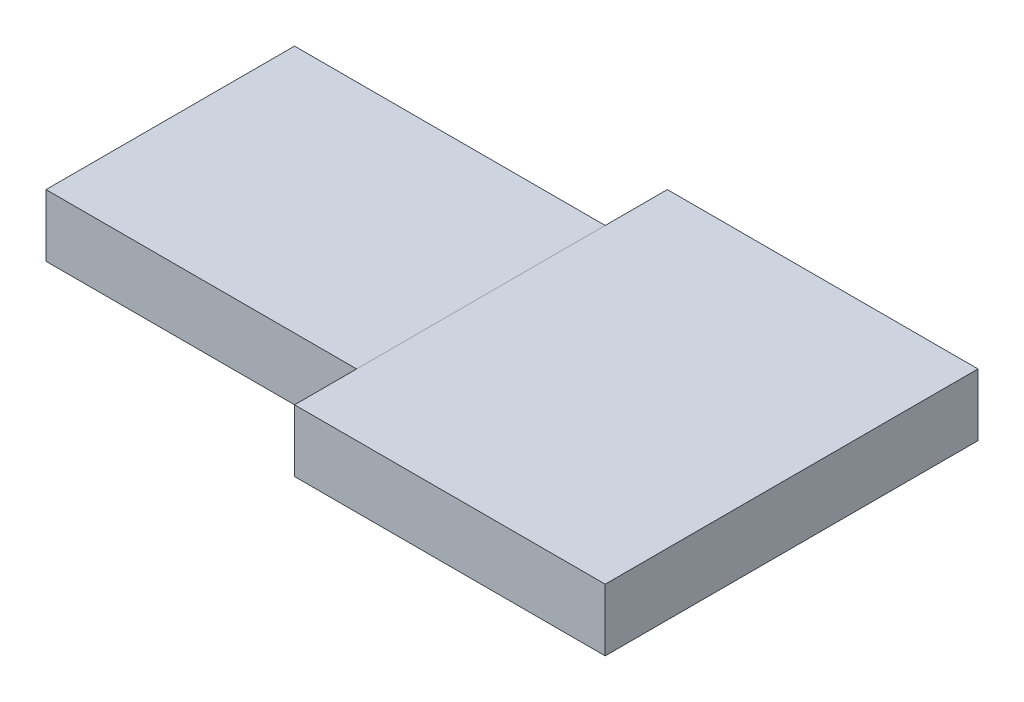
ISO-10303-21;
HEADER;
FILE_DESCRIPTION(('STEP AP214'),'2;1');
FILE_NAME('part.step','',(''),(''),'','','');
FILE_SCHEMA(('AUTOMOTIVE_DESIGN { 1 0 10303 214 1 1 1 1 }'));
ENDSEC;
DATA;
#1=APPLICATION_CONTEXT('core data for automotive mechanical design processes');
#2=APPLICATION_PROTOCOL_DEFINITION('international standard','automotive_design',2000,#1);
#3=PRODUCT_CONTEXT('',#1,'mechanical');
#4=PRODUCT('Part','Part','',(#3));
#5=PRODUCT_RELATED_PRODUCT_CATEGORY('part','',(#4));
#6=PRODUCT_DEFINITION_FORMATION('','',#4);
#7=PRODUCT_DEFINITION_CONTEXT('part definition',#1,'design');
#8=PRODUCT_DEFINITION('design','',#6,#7);
#9=PRODUCT_DEFINITION_SHAPE('','',#8);
#10=(LENGTH_UNIT() NAMED_UNIT(*) SI_UNIT(.MILLI.,.METRE.));
#11=(NAMED_UNIT(*) PLANE_ANGLE_UNIT() SI_UNIT($,.RADIAN.));
#12=(NAMED_UNIT(*) SI_UNIT($,.STERADIAN.) SOLID_ANGLE_UNIT());
#13=UNCERTAINTY_MEASURE_WITH_UNIT(LENGTH_MEASURE(1.E-05),#10,'distance_accuracy_value','');
#14=(GEOMETRIC_REPRESENTATION_CONTEXT(3) GLOBAL_UNCERTAINTY_ASSIGNED_CONTEXT((#13)) GLOBAL_UNIT_ASSIGNED_CONTEXT((#10,
#11,#12)) REPRESENTATION_CONTEXT('',''));
#15=CARTESIAN_POINT('',(0.,0.,0.));
#16=DIRECTION('',(0.,0.,1.));
#17=DIRECTION('',(1.,0.,0.));
#18=AXIS2_PLACEMENT_3D('',#15,#16,#17);
#19=CARTESIAN_POINT('',(0.,-5.,0.));
#20=DIRECTION('',(0.,-1.,0.));
#21=DIRECTION('',(0.,0.,-1.));
#22=AXIS2_PLACEMENT_3D('',#19,#20,#21);
#23=PLANE('',#22);
#24=DIRECTION('',(1.,0.,0.));
#25=VECTOR('',#24,1.);
#26=CARTESIAN_POINT('',(-50.,-5.,30.));
#27=LINE('',#26,#25);
#28=CARTESIAN_POINT('',(0.,-5.,30.));
#29=VERTEX_POINT('',#28);
#30=CARTESIAN_POINT('',(50.,-5.,30.));
#31=VERTEX_POINT('',#30);
#32=EDGE_CURVE('E143',#29,#31,#27,.T.);
#33=ORIENTED_EDGE('',*,*,#32,.F.);
#34=DIRECTION('',(0.,0.,-1.));
#35=VECTOR('',#34,1.);
#36=CARTESIAN_POINT('',(0.,-5.,-30.));
#37=LINE('',#36,#35);
#38=CARTESIAN_POINT('',(0.,-5.,-30.));
#39=VERTEX_POINT('',#38);
#40=EDGE_CURVE('E128',#29,#39,#37,.T.);
#41=ORIENTED_EDGE('',*,*,#40,.T.);
#42=DIRECTION('',(-1.,0.,0.));
#43=VECTOR('',#42,1.);
#44=CARTESIAN_POINT('',(-50.,-5.,-30.));
#45=LINE('',#44,#43);
#46=CARTESIAN_POINT('',(50.,-5.,-30.));
#47=VERTEX_POINT('',#46);
#48=EDGE_CURVE('E150',#47,#39,#45,.T.);
#49=ORIENTED_EDGE('',*,*,#48,.F.);
#50=DIRECTION('',(0.,0.,-1.));
#51=VECTOR('',#50,1.);
#52=CARTESIAN_POINT('',(50.,-5.,30.));
#53=LINE('',#52,#51);
#54=EDGE_CURVE('E126',#31,#47,#53,.T.);
#55=ORIENTED_EDGE('',*,*,#54,.F.);
#56=EDGE_LOOP('',(#33,#41,#49,#55));
#57=FACE_BOUND('',#56,.T.);
#58=ADVANCED_FACE('F41',(#57),#23,.T.);
#59=CARTESIAN_POINT('',(50.,5.,30.));
#60=DIRECTION('',(-1.,0.,0.));
#61=DIRECTION('',(0.,0.,1.));
#62=AXIS2_PLACEMENT_3D('',#59,#60,#61);
#63=PLANE('',#62);
#64=ORIENTED_EDGE('',*,*,#54,.T.);
#65=DIRECTION('',(0.,-1.,0.));
#66=VECTOR('',#65,1.);
#67=CARTESIAN_POINT('',(50.,5.,-30.));
#68=LINE('',#67,#66);
#69=CARTESIAN_POINT('',(50.,5.,-30.));
#70=VERTEX_POINT('',#69);
#71=EDGE_CURVE('E11',#70,#47,#68,.T.);
#72=ORIENTED_EDGE('',*,*,#71,.F.);
#73=DIRECTION('',(0.,0.,-1.));
#74=VECTOR('',#73,1.);
#75=CARTESIAN_POINT('',(50.,5.,30.));
#76=LINE('',#75,#74);
#77=CARTESIAN_POINT('',(50.,5.,30.));
#78=VERTEX_POINT('',#77);
#79=EDGE_CURVE('E139',#78,#70,#76,.T.);
#80=ORIENTED_EDGE('',*,*,#79,.F.);
#81=DIRECTION('',(0.,-1.,0.));
#82=VECTOR('',#81,1.);
#83=CARTESIAN_POINT('',(50.,5.,30.));
#84=LINE('',#83,#82);
#85=EDGE_CURVE('E49',#78,#31,#84,.T.);
#86=ORIENTED_EDGE('',*,*,#85,.T.);
#87=EDGE_LOOP('',(#64,#72,#80,#86));
#88=FACE_BOUND('',#87,.T.);
#89=ADVANCED_FACE('F43',(#88),#63,.F.);
#90=CARTESIAN_POINT('',(-50.,5.,-30.));
#91=DIRECTION('',(0.,0.,1.));
#92=DIRECTION('',(1.,0.,0.));
#93=AXIS2_PLACEMENT_3D('',#90,#91,#92);
#94=PLANE('',#93);
#95=ORIENTED_EDGE('',*,*,#48,.T.);
#96=DIRECTION('',(0.,1.,0.));
#97=VECTOR('',#96,1.);
#98=CARTESIAN_POINT('',(0.,-5.,-30.));
#99=LINE('',#98,#97);
#100=CARTESIAN_POINT('',(0.,5.,-30.));
#101=VERTEX_POINT('',#100);
#102=EDGE_CURVE('E122',#39,#101,#99,.T.);
#103=ORIENTED_EDGE('',*,*,#102,.T.);
#104=DIRECTION('',(-1.,0.,0.));
#105=VECTOR('',#104,1.);
#106=CARTESIAN_POINT('',(-50.,5.,-30.));
#107=LINE('',#106,#105);
#108=EDGE_CURVE('E142',#70,#101,#107,.T.);
#109=ORIENTED_EDGE('',*,*,#108,.F.);
#110=ORIENTED_EDGE('',*,*,#71,.T.);
#111=EDGE_LOOP('',(#95,#103,#109,#110));
#112=FACE_BOUND('',#111,.T.);
#113=ADVANCED_FACE('F165',(#112),#94,.F.);
#114=CARTESIAN_POINT('',(-50.,5.,30.));
#115=DIRECTION('',(1.,0.,0.));
#116=DIRECTION('',(0.,0.,-1.));
#117=AXIS2_PLACEMENT_3D('',#114,#115,#116);
#118=PLANE('',#117);
#119=DIRECTION('',(0.,1.,0.));
#120=VECTOR('',#119,1.);
#121=CARTESIAN_POINT('',(-50.,-5.,-20.));
#122=LINE('',#121,#120);
#123=CARTESIAN_POINT('',(-50.,-4.999,-20.));
#124=VERTEX_POINT('',#123);
#125=CARTESIAN_POINT('',(-50.,4.999,-20.));
#126=VERTEX_POINT('',#125);
#127=EDGE_CURVE('E123',#124,#126,#122,.T.);
#128=ORIENTED_EDGE('',*,*,#127,.F.);
#129=DIRECTION('',(0.,0.,1.));
#130=VECTOR('',#129,1.);
#131=CARTESIAN_POINT('',(-50.,-4.999,-20.));
#132=LINE('',#131,#130);
#133=CARTESIAN_POINT('',(-50.,-4.999,20.));
#134=VERTEX_POINT('',#133);
#135=EDGE_CURVE('E56',#124,#134,#132,.T.);
#136=ORIENTED_EDGE('',*,*,#135,.T.);
#137=DIRECTION('',(0.,1.,0.));
#138=VECTOR('',#137,1.);
#139=CARTESIAN_POINT('',(-50.,-5.,20.));
#140=LINE('',#139,#138);
#141=CARTESIAN_POINT('',(-50.,4.999,20.));
#142=VERTEX_POINT('',#141);
#143=EDGE_CURVE('E137',#134,#142,#140,.T.);
#144=ORIENTED_EDGE('',*,*,#143,.T.);
#145=DIRECTION('',(0.,0.,1.));
#146=VECTOR('',#145,1.);
#147=CARTESIAN_POINT('',(-50.,4.999,-20.));
#148=LINE('',#147,#146);
#149=EDGE_CURVE('E178',#126,#142,#148,.T.);
#150=ORIENTED_EDGE('',*,*,#149,.F.);
#151=EDGE_LOOP('',(#128,#136,#144,#150));
#152=FACE_BOUND('',#151,.T.);
#153=ADVANCED_FACE('F184',(#152),#118,.F.);
#154=CARTESIAN_POINT('',(-50.,5.,30.));
#155=DIRECTION('',(0.,0.,-1.));
#156=DIRECTION('',(-1.,0.,0.));
#157=AXIS2_PLACEMENT_3D('',#154,#155,#156);
#158=PLANE('',#157);
#159=DIRECTION('',(1.,0.,0.));
#160=VECTOR('',#159,1.);
#161=CARTESIAN_POINT('',(-50.,5.,30.));
#162=LINE('',#161,#160);
#163=CARTESIAN_POINT('',(0.,5.,30.));
#164=VERTEX_POINT('',#163);
#165=EDGE_CURVE('E146',#164,#78,#162,.T.);
#166=ORIENTED_EDGE('',*,*,#165,.F.);
#167=DIRECTION('',(0.,1.,0.));
#168=VECTOR('',#167,1.);
#169=CARTESIAN_POINT('',(0.,-5.,30.));
#170=LINE('',#169,#168);
#171=EDGE_CURVE('E132',#29,#164,#170,.T.);
#172=ORIENTED_EDGE('',*,*,#171,.F.);
#173=ORIENTED_EDGE('',*,*,#32,.T.);
#174=ORIENTED_EDGE('',*,*,#85,.F.);
#175=EDGE_LOOP('',(#166,#172,#173,#174));
#176=FACE_BOUND('',#175,.T.);
#177=ADVANCED_FACE('F169',(#176),#158,.F.);
#178=CARTESIAN_POINT('',(0.,5.,0.));
#179=DIRECTION('',(0.,-1.,0.));
#180=DIRECTION('',(0.,0.,-1.));
#181=AXIS2_PLACEMENT_3D('',#178,#179,#180);
#182=PLANE('',#181);
#183=DIRECTION('',(0.,0.,-1.));
#184=VECTOR('',#183,1.);
#185=CARTESIAN_POINT('',(0.,5.,-30.));
#186=LINE('',#185,#184);
#187=EDGE_CURVE('E135',#164,#101,#186,.T.);
#188=ORIENTED_EDGE('',*,*,#187,.F.);
#189=ORIENTED_EDGE('',*,*,#165,.T.);
#190=ORIENTED_EDGE('',*,*,#79,.T.);
#191=ORIENTED_EDGE('',*,*,#108,.T.);
#192=EDGE_LOOP('',(#188,#189,#190,#191));
#193=FACE_BOUND('',#192,.T.);
#194=ADVANCED_FACE('F167',(#193),#182,.F.);
#195=CARTESIAN_POINT('',(-50.,-5.,20.));
#196=DIRECTION('',(0.,0.,-1.));
#197=DIRECTION('',(-1.,0.,0.));
#198=AXIS2_PLACEMENT_3D('',#195,#196,#197);
#199=PLANE('',#198);
#200=ORIENTED_EDGE('',*,*,#143,.F.);
#201=DIRECTION('',(1.,0.,0.));
#202=VECTOR('',#201,1.);
#203=CARTESIAN_POINT('',(0.,-4.999,20.));
#204=LINE('',#203,#202);
#205=CARTESIAN_POINT('',(0.,-4.999,20.));
#206=VERTEX_POINT('',#205);
#207=EDGE_CURVE('E111',#134,#206,#204,.T.);
#208=ORIENTED_EDGE('',*,*,#207,.T.);
#209=DIRECTION('',(0.,1.,0.));
#210=VECTOR('',#209,1.);
#211=CARTESIAN_POINT('',(0.,-5.,20.));
#212=LINE('',#211,#210);
#213=CARTESIAN_POINT('',(0.,4.999,20.));
#214=VERTEX_POINT('',#213);
#215=EDGE_CURVE('E109',#206,#214,#212,.T.);
#216=ORIENTED_EDGE('',*,*,#215,.T.);
#217=DIRECTION('',(1.,0.,0.));
#218=VECTOR('',#217,1.);
#219=CARTESIAN_POINT('',(0.,4.999,20.));
#220=LINE('',#219,#218);
#221=EDGE_CURVE('E175',#142,#214,#220,.T.);
#222=ORIENTED_EDGE('',*,*,#221,.F.);
#223=EDGE_LOOP('',(#200,#208,#216,#222));
#224=FACE_BOUND('',#223,.T.);
#225=ADVANCED_FACE('F188',(#224),#199,.F.);
#226=CARTESIAN_POINT('',(0.,-5.,-30.));
#227=DIRECTION('',(1.,0.,0.));
#228=DIRECTION('',(0.,0.,-1.));
#229=AXIS2_PLACEMENT_3D('',#226,#227,#228);
#230=PLANE('',#229);
#231=ORIENTED_EDGE('',*,*,#215,.F.);
#232=DIRECTION('',(0.,0.,-1.));
#233=VECTOR('',#232,1.);
#234=CARTESIAN_POINT('',(0.,-4.999,-20.));
#235=LINE('',#234,#233);
#236=CARTESIAN_POINT('',(0.,-4.999,-20.));
#237=VERTEX_POINT('',#236);
#238=EDGE_CURVE('E106',#206,#237,#235,.T.);
#239=ORIENTED_EDGE('',*,*,#238,.T.);
#240=DIRECTION('',(0.,1.,0.));
#241=VECTOR('',#240,1.);
#242=CARTESIAN_POINT('',(0.,-5.,-20.));
#243=LINE('',#242,#241);
#244=CARTESIAN_POINT('',(0.,4.999,-20.));
#245=VERTEX_POINT('',#244);
#246=EDGE_CURVE('E64',#237,#245,#243,.T.);
#247=ORIENTED_EDGE('',*,*,#246,.T.);
#248=DIRECTION('',(0.,0.,-1.));
#249=VECTOR('',#248,1.);
#250=CARTESIAN_POINT('',(0.,4.999,-20.));
#251=LINE('',#250,#249);
#252=EDGE_CURVE('E173',#214,#245,#251,.T.);
#253=ORIENTED_EDGE('',*,*,#252,.F.);
#254=EDGE_LOOP('',(#231,#239,#247,#253));
#255=FACE_BOUND('',#254,.T.);
#256=ORIENTED_EDGE('',*,*,#187,.T.);
#257=ORIENTED_EDGE('',*,*,#102,.F.);
#258=ORIENTED_EDGE('',*,*,#40,.F.);
#259=ORIENTED_EDGE('',*,*,#171,.T.);
#260=EDGE_LOOP('',(#256,#257,#258,#259));
#261=FACE_BOUND('',#260,.T.);
#262=ADVANCED_FACE('F107',(#255,#261),#230,.F.);
#263=CARTESIAN_POINT('',(-50.,-5.,-20.));
#264=DIRECTION('',(0.,0.,1.));
#265=DIRECTION('',(1.,0.,0.));
#266=AXIS2_PLACEMENT_3D('',#263,#264,#265);
#267=PLANE('',#266);
#268=ORIENTED_EDGE('',*,*,#246,.F.);
#269=DIRECTION('',(-1.,0.,0.));
#270=VECTOR('',#269,1.);
#271=CARTESIAN_POINT('',(-50.,-4.999,-20.));
#272=LINE('',#271,#270);
#273=EDGE_CURVE('E112',#237,#124,#272,.T.);
#274=ORIENTED_EDGE('',*,*,#273,.T.);
#275=ORIENTED_EDGE('',*,*,#127,.T.);
#276=DIRECTION('',(-1.,0.,0.));
#277=VECTOR('',#276,1.);
#278=CARTESIAN_POINT('',(-50.,4.999,-20.));
#279=LINE('',#278,#277);
#280=EDGE_CURVE('E121',#245,#126,#279,.T.);
#281=ORIENTED_EDGE('',*,*,#280,.F.);
#282=EDGE_LOOP('',(#268,#274,#275,#281));
#283=FACE_BOUND('',#282,.T.);
#284=ADVANCED_FACE('F119',(#283),#267,.F.);
#285=CARTESIAN_POINT('',(0.,4.999,0.));
#286=DIRECTION('',(0.,-1.,0.));
#287=DIRECTION('',(0.,0.,-1.));
#288=AXIS2_PLACEMENT_3D('',#285,#286,#287);
#289=PLANE('',#288);
#290=ORIENTED_EDGE('',*,*,#149,.T.);
#291=ORIENTED_EDGE('',*,*,#221,.T.);
#292=ORIENTED_EDGE('',*,*,#252,.T.);
#293=ORIENTED_EDGE('',*,*,#280,.T.);
#294=EDGE_LOOP('',(#290,#291,#292,#293));
#295=FACE_BOUND('',#294,.T.);
#296=ADVANCED_FACE('F190',(#295),#289,.F.);
#297=CARTESIAN_POINT('',(0.,-4.999,0.));
#298=DIRECTION('',(0.,1.,0.));
#299=DIRECTION('',(0.,0.,-1.));
#300=AXIS2_PLACEMENT_3D('',#297,#298,#299);
#301=PLANE('',#300);
#302=ORIENTED_EDGE('',*,*,#135,.F.);
#303=ORIENTED_EDGE('',*,*,#273,.F.);
#304=ORIENTED_EDGE('',*,*,#238,.F.);
#305=ORIENTED_EDGE('',*,*,#207,.F.);
#306=EDGE_LOOP('',(#302,#303,#304,#305));
#307=FACE_BOUND('',#306,.T.);
#308=ADVANCED_FACE('F114',(#307),#301,.F.);
#309=CLOSED_SHELL('',(#58,#89,#113,#153,#177,#194,#225,#262,#284,#296,#308));
#310=MANIFOLD_SOLID_BREP('B2',#309);
#311=ADVANCED_BREP_SHAPE_REPRESENTATION('',(#18,#310),#14);
#312=SHAPE_DEFINITION_REPRESENTATION(#9,#311);
ENDSEC;
END-ISO-10303-21;
